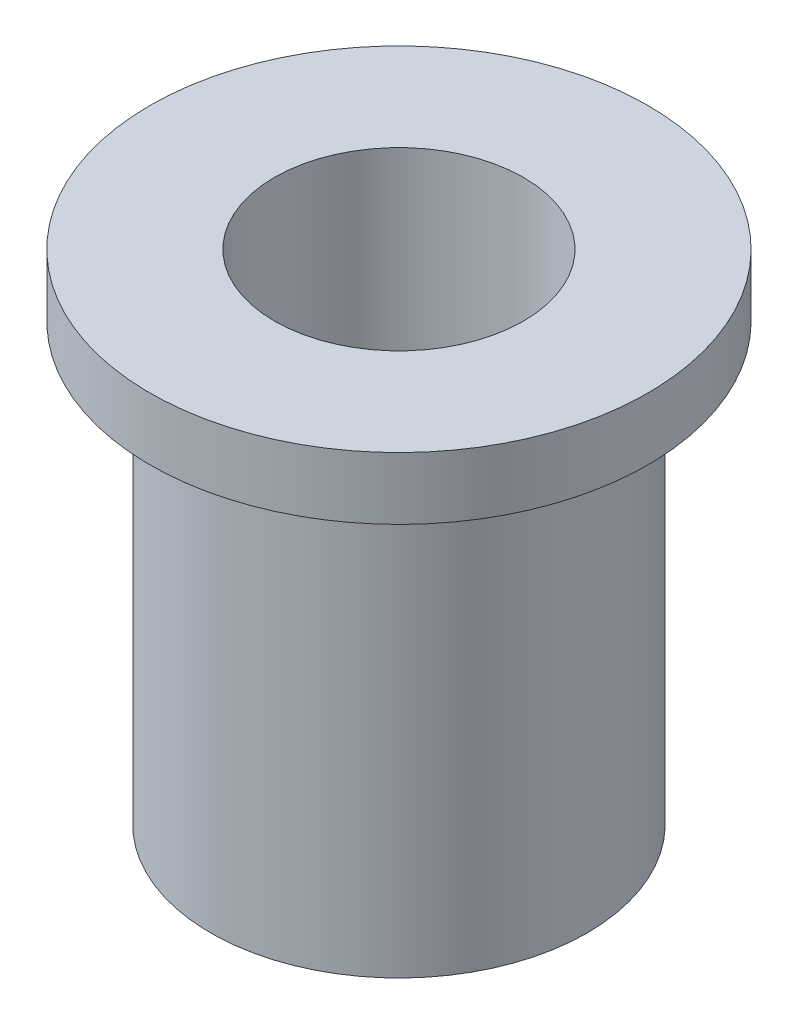
ISO-10303-21;
HEADER;
FILE_DESCRIPTION(('STEP AP214'),'2;1');
FILE_NAME('part.step','',(''),(''),'','','');
FILE_SCHEMA(('AUTOMOTIVE_DESIGN { 1 0 10303 214 1 1 1 1 }'));
ENDSEC;
DATA;
#1=APPLICATION_CONTEXT('core data for automotive mechanical design processes');
#2=APPLICATION_PROTOCOL_DEFINITION('international standard','automotive_design',2000,#1);
#3=PRODUCT_CONTEXT('',#1,'mechanical');
#4=PRODUCT('Part','Part','',(#3));
#5=PRODUCT_RELATED_PRODUCT_CATEGORY('part','',(#4));
#6=PRODUCT_DEFINITION_FORMATION('','',#4);
#7=PRODUCT_DEFINITION_CONTEXT('part definition',#1,'design');
#8=PRODUCT_DEFINITION('design','',#6,#7);
#9=PRODUCT_DEFINITION_SHAPE('','',#8);
#10=(LENGTH_UNIT() NAMED_UNIT(*) SI_UNIT(.MILLI.,.METRE.));
#11=(NAMED_UNIT(*) PLANE_ANGLE_UNIT() SI_UNIT($,.RADIAN.));
#12=(NAMED_UNIT(*) SI_UNIT($,.STERADIAN.) SOLID_ANGLE_UNIT());
#13=UNCERTAINTY_MEASURE_WITH_UNIT(LENGTH_MEASURE(1.E-05),#10,'distance_accuracy_value','');
#14=(GEOMETRIC_REPRESENTATION_CONTEXT(3) GLOBAL_UNCERTAINTY_ASSIGNED_CONTEXT((#13)) GLOBAL_UNIT_ASSIGNED_CONTEXT((#10,
#11,#12)) REPRESENTATION_CONTEXT('',''));
#15=CARTESIAN_POINT('',(0.,0.,0.));
#16=DIRECTION('',(0.,0.,1.));
#17=DIRECTION('',(1.,0.,0.));
#18=AXIS2_PLACEMENT_3D('',#15,#16,#17);
#19=CARTESIAN_POINT('',(11.7921349388379,-14.9118947502548,0.));
#20=DIRECTION('',(0.,-1.,0.));
#21=DIRECTION('',(1.,0.,0.));
#22=AXIS2_PLACEMENT_3D('',#19,#20,#21);
#23=PLANE('',#22);
#24=CARTESIAN_POINT('',(5.44213493883792,-14.9118947502548,0.));
#25=DIRECTION('',(0.,1.,0.));
#26=DIRECTION('',(-1.,0.,0.));
#27=AXIS2_PLACEMENT_3D('',#24,#25,#26);
#28=CIRCLE('',#27,3.175);
#29=CARTESIAN_POINT('',(2.26713493883792,-14.9118947502548,0.));
#30=VERTEX_POINT('',#29);
#31=EDGE_CURVE('E10',#30,#30,#28,.T.);
#32=ORIENTED_EDGE('',*,*,#31,.F.);
#33=EDGE_LOOP('',(#32));
#34=FACE_BOUND('',#33,.T.);
#35=CARTESIAN_POINT('',(5.44213493883792,-14.9118947502548,0.));
#36=DIRECTION('',(0.,1.,0.));
#37=DIRECTION('',(-1.,0.,0.));
#38=AXIS2_PLACEMENT_3D('',#35,#36,#37);
#39=CIRCLE('',#38,6.34999999999999);
#40=CARTESIAN_POINT('',(-0.907865061162073,-14.9118947502548,0.));
#41=VERTEX_POINT('',#40);
#42=EDGE_CURVE('E52',#41,#41,#39,.T.);
#43=ORIENTED_EDGE('',*,*,#42,.T.);
#44=EDGE_LOOP('',(#43));
#45=FACE_BOUND('',#44,.T.);
#46=ADVANCED_FACE('F30',(#34,#45),#23,.F.);
#47=CARTESIAN_POINT('',(5.44213493883792,36.3216870540265,0.));
#48=DIRECTION('',(0.,1.,0.));
#49=DIRECTION('',(-1.,0.,0.));
#50=AXIS2_PLACEMENT_3D('',#47,#48,#49);
#51=CYLINDRICAL_SURFACE('',#50,3.175);
#52=CARTESIAN_POINT('',(5.44213493883792,-27.6118947502548,0.));
#53=DIRECTION('',(0.,1.,0.));
#54=DIRECTION('',(-1.,0.,0.));
#55=AXIS2_PLACEMENT_3D('',#52,#53,#54);
#56=CIRCLE('',#55,3.175);
#57=CARTESIAN_POINT('',(2.26713493883792,-27.6118947502548,0.));
#58=VERTEX_POINT('',#57);
#59=EDGE_CURVE('E36',#58,#58,#56,.T.);
#60=ORIENTED_EDGE('',*,*,#59,.F.);
#61=EDGE_LOOP('',(#60));
#62=FACE_BOUND('',#61,.T.);
#63=ORIENTED_EDGE('',*,*,#31,.T.);
#64=EDGE_LOOP('',(#63));
#65=FACE_BOUND('',#64,.T.);
#66=ADVANCED_FACE('F77',(#62,#65),#51,.F.);
#67=CARTESIAN_POINT('',(8.61713493883792,-27.6118947502548,0.));
#68=DIRECTION('',(0.,1.,0.));
#69=DIRECTION('',(-1.,0.,0.));
#70=AXIS2_PLACEMENT_3D('',#67,#68,#69);
#71=PLANE('',#70);
#72=CARTESIAN_POINT('',(5.44213493883792,-27.6118947502548,0.));
#73=DIRECTION('',(0.,1.,0.));
#74=DIRECTION('',(-1.,0.,0.));
#75=AXIS2_PLACEMENT_3D('',#72,#73,#74);
#76=CIRCLE('',#75,4.8006);
#77=CARTESIAN_POINT('',(0.641534938837918,-27.6118947502548,0.));
#78=VERTEX_POINT('',#77);
#79=EDGE_CURVE('E40',#78,#78,#76,.T.);
#80=ORIENTED_EDGE('',*,*,#79,.F.);
#81=EDGE_LOOP('',(#80));
#82=FACE_BOUND('',#81,.T.);
#83=ORIENTED_EDGE('',*,*,#59,.T.);
#84=EDGE_LOOP('',(#83));
#85=FACE_BOUND('',#84,.T.);
#86=ADVANCED_FACE('F72',(#82,#85),#71,.F.);
#87=CARTESIAN_POINT('',(5.44213493883792,36.3216870540265,0.));
#88=DIRECTION('',(0.,1.,0.));
#89=DIRECTION('',(-1.,0.,0.));
#90=AXIS2_PLACEMENT_3D('',#87,#88,#89);
#91=CYLINDRICAL_SURFACE('',#90,4.8006);
#92=CARTESIAN_POINT('',(5.44213493883792,-16.4993947502549,0.));
#93=DIRECTION('',(0.,1.,0.));
#94=DIRECTION('',(-1.,0.,0.));
#95=AXIS2_PLACEMENT_3D('',#92,#93,#94);
#96=CIRCLE('',#95,4.8006);
#97=CARTESIAN_POINT('',(0.64153493883792,-16.4993947502549,0.));
#98=VERTEX_POINT('',#97);
#99=EDGE_CURVE('E44',#98,#98,#96,.T.);
#100=ORIENTED_EDGE('',*,*,#99,.F.);
#101=EDGE_LOOP('',(#100));
#102=FACE_BOUND('',#101,.T.);
#103=ORIENTED_EDGE('',*,*,#79,.T.);
#104=EDGE_LOOP('',(#103));
#105=FACE_BOUND('',#104,.T.);
#106=ADVANCED_FACE('F66',(#102,#105),#91,.T.);
#107=CARTESIAN_POINT('',(10.2427349388379,-16.4993947502549,0.));
#108=DIRECTION('',(0.,1.,0.));
#109=DIRECTION('',(-1.,0.,0.));
#110=AXIS2_PLACEMENT_3D('',#107,#108,#109);
#111=PLANE('',#110);
#112=CARTESIAN_POINT('',(5.44213493883792,-16.4993947502548,0.));
#113=DIRECTION('',(0.,1.,0.));
#114=DIRECTION('',(-1.,0.,0.));
#115=AXIS2_PLACEMENT_3D('',#112,#113,#114);
#116=CIRCLE('',#115,6.35);
#117=CARTESIAN_POINT('',(-0.907865061162074,-16.4993947502548,0.));
#118=VERTEX_POINT('',#117);
#119=EDGE_CURVE('E49',#118,#118,#116,.T.);
#120=ORIENTED_EDGE('',*,*,#119,.F.);
#121=EDGE_LOOP('',(#120));
#122=FACE_BOUND('',#121,.T.);
#123=ORIENTED_EDGE('',*,*,#99,.T.);
#124=EDGE_LOOP('',(#123));
#125=FACE_BOUND('',#124,.T.);
#126=ADVANCED_FACE('F60',(#122,#125),#111,.F.);
#127=CARTESIAN_POINT('',(5.44213493883792,36.3216870540265,0.));
#128=DIRECTION('',(0.,1.,0.));
#129=DIRECTION('',(-1.,0.,0.));
#130=AXIS2_PLACEMENT_3D('',#127,#128,#129);
#131=CYLINDRICAL_SURFACE('',#130,6.34999999999999);
#132=ORIENTED_EDGE('',*,*,#42,.F.);
#133=EDGE_LOOP('',(#132));
#134=FACE_BOUND('',#133,.T.);
#135=ORIENTED_EDGE('',*,*,#119,.T.);
#136=EDGE_LOOP('',(#135));
#137=FACE_BOUND('',#136,.T.);
#138=ADVANCED_FACE('F57',(#134,#137),#131,.T.);
#139=CLOSED_SHELL('',(#46,#66,#86,#106,#126,#138));
#140=MANIFOLD_SOLID_BREP('B2',#139);
#141=ADVANCED_BREP_SHAPE_REPRESENTATION('',(#18,#140),#14);
#142=SHAPE_DEFINITION_REPRESENTATION(#9,#141);
ENDSEC;
END-ISO-10303-21;
